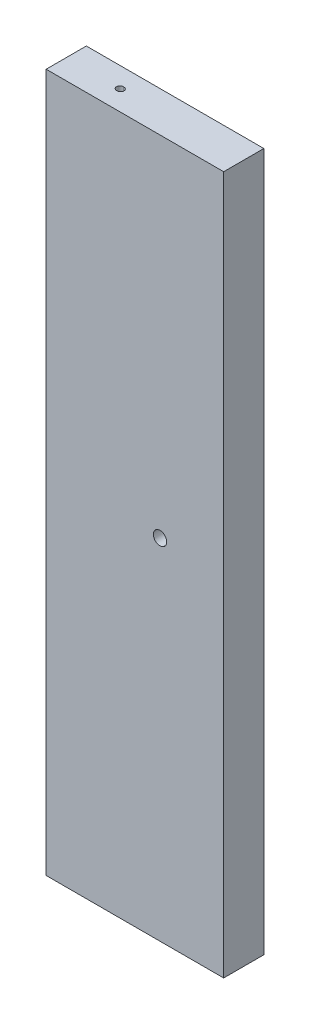
ISO-10303-21;
HEADER;
FILE_DESCRIPTION(('STEP AP214'),'2;1');
FILE_NAME('part.step','',(''),(''),'','','');
FILE_SCHEMA(('AUTOMOTIVE_DESIGN { 1 0 10303 214 1 1 1 1 }'));
ENDSEC;
DATA;
#1=APPLICATION_CONTEXT('core data for automotive mechanical design processes');
#2=APPLICATION_PROTOCOL_DEFINITION('international standard','automotive_design',2000,#1);
#3=PRODUCT_CONTEXT('',#1,'mechanical');
#4=PRODUCT('Part','Part','',(#3));
#5=PRODUCT_RELATED_PRODUCT_CATEGORY('part','',(#4));
#6=PRODUCT_DEFINITION_FORMATION('','',#4);
#7=PRODUCT_DEFINITION_CONTEXT('part definition',#1,'design');
#8=PRODUCT_DEFINITION('design','',#6,#7);
#9=PRODUCT_DEFINITION_SHAPE('','',#8);
#10=(LENGTH_UNIT() NAMED_UNIT(*) SI_UNIT(.MILLI.,.METRE.));
#11=(NAMED_UNIT(*) PLANE_ANGLE_UNIT() SI_UNIT($,.RADIAN.));
#12=(NAMED_UNIT(*) SI_UNIT($,.STERADIAN.) SOLID_ANGLE_UNIT());
#13=UNCERTAINTY_MEASURE_WITH_UNIT(LENGTH_MEASURE(1.E-05),#10,'distance_accuracy_value','');
#14=(GEOMETRIC_REPRESENTATION_CONTEXT(3) GLOBAL_UNCERTAINTY_ASSIGNED_CONTEXT((#13)) GLOBAL_UNIT_ASSIGNED_CONTEXT((#10,
#11,#12)) REPRESENTATION_CONTEXT('',''));
#15=CARTESIAN_POINT('',(0.,0.,0.));
#16=DIRECTION('',(0.,0.,1.));
#17=DIRECTION('',(1.,0.,0.));
#18=AXIS2_PLACEMENT_3D('',#15,#16,#17);
#19=CARTESIAN_POINT('',(209.352967180639,93.4499999969934,19.05));
#20=DIRECTION('',(1.,0.,0.));
#21=DIRECTION('',(0.,1.,0.));
#22=AXIS2_PLACEMENT_3D('',#19,#20,#21);
#23=PLANE('',#22);
#24=CARTESIAN_POINT('',(209.352967180642,-72.0249999970022,9.52499999998519));
#25=DIRECTION('',(1.,0.,0.));
#26=DIRECTION('',(0.,1.,0.));
#27=AXIS2_PLACEMENT_3D('',#24,#25,#26);
#28=CIRCLE('',#27,1.58750000000001);
#29=CARTESIAN_POINT('',(209.352967180642,-70.4374999970022,9.52499999998519));
#30=VERTEX_POINT('',#29);
#31=EDGE_CURVE('E144',#30,#30,#28,.T.);
#32=ORIENTED_EDGE('',*,*,#31,.T.);
#33=EDGE_LOOP('',(#32));
#34=FACE_BOUND('',#33,.T.);
#35=CARTESIAN_POINT('',(209.352967180644,-154.762499994006,9.52499999998514));
#36=DIRECTION('',(1.,0.,0.));
#37=DIRECTION('',(0.,1.,0.));
#38=AXIS2_PLACEMENT_3D('',#35,#36,#37);
#39=CIRCLE('',#38,1.58749999999999);
#40=CARTESIAN_POINT('',(209.352967180644,-153.174999994006,9.52499999998514));
#41=VERTEX_POINT('',#40);
#42=EDGE_CURVE('E148',#41,#41,#39,.T.);
#43=ORIENTED_EDGE('',*,*,#42,.T.);
#44=EDGE_LOOP('',(#43));
#45=FACE_BOUND('',#44,.T.);
#46=CARTESIAN_POINT('',(209.352967180641,10.7124999999862,9.52499999998519));
#47=DIRECTION('',(1.,0.,0.));
#48=DIRECTION('',(0.,1.,0.));
#49=AXIS2_PLACEMENT_3D('',#46,#47,#48);
#50=CIRCLE('',#49,1.5875);
#51=CARTESIAN_POINT('',(209.352967180641,12.2999999999862,9.52499999998519));
#52=VERTEX_POINT('',#51);
#53=EDGE_CURVE('E152',#52,#52,#50,.T.);
#54=ORIENTED_EDGE('',*,*,#53,.T.);
#55=EDGE_LOOP('',(#54));
#56=FACE_BOUND('',#55,.T.);
#57=DIRECTION('',(0.,-1.,0.));
#58=VECTOR('',#57,1.);
#59=CARTESIAN_POINT('',(209.352967180639,93.4499999969934,0.));
#60=LINE('',#59,#58);
#61=CARTESIAN_POINT('',(209.352967180639,93.4499999969934,0.));
#62=VERTEX_POINT('',#61);
#63=CARTESIAN_POINT('',(209.352967180645,-237.499999991006,0.));
#64=VERTEX_POINT('',#63);
#65=EDGE_CURVE('E156',#62,#64,#60,.T.);
#66=ORIENTED_EDGE('',*,*,#65,.T.);
#67=DIRECTION('',(0.,0.,-1.));
#68=VECTOR('',#67,1.);
#69=CARTESIAN_POINT('',(209.352967180645,-237.499999991006,19.05));
#70=LINE('',#69,#68);
#71=CARTESIAN_POINT('',(209.352967180645,-237.499999991006,19.05));
#72=VERTEX_POINT('',#71);
#73=EDGE_CURVE('E158',#72,#64,#70,.T.);
#74=ORIENTED_EDGE('',*,*,#73,.F.);
#75=DIRECTION('',(0.,-1.,0.));
#76=VECTOR('',#75,1.);
#77=CARTESIAN_POINT('',(209.352967180639,93.4499999969934,19.05));
#78=LINE('',#77,#76);
#79=CARTESIAN_POINT('',(209.352967180639,93.4499999969934,19.05));
#80=VERTEX_POINT('',#79);
#81=EDGE_CURVE('E177',#80,#72,#78,.T.);
#82=ORIENTED_EDGE('',*,*,#81,.F.);
#83=DIRECTION('',(0.,0.,-1.));
#84=VECTOR('',#83,1.);
#85=CARTESIAN_POINT('',(209.352967180639,93.4499999969934,19.05));
#86=LINE('',#85,#84);
#87=EDGE_CURVE('E159',#80,#62,#86,.T.);
#88=ORIENTED_EDGE('',*,*,#87,.T.);
#89=EDGE_LOOP('',(#66,#74,#82,#88));
#90=FACE_BOUND('',#89,.T.);
#91=ADVANCED_FACE('F41',(#34,#45,#56,#90),#23,.F.);
#92=CARTESIAN_POINT('',(209.352967180645,-237.499999991006,19.05));
#93=DIRECTION('',(0.,1.,0.));
#94=DIRECTION('',(0.,0.,1.));
#95=AXIS2_PLACEMENT_3D('',#92,#93,#94);
#96=PLANE('',#95);
#97=DIRECTION('',(1.,0.,0.));
#98=VECTOR('',#97,1.);
#99=CARTESIAN_POINT('',(209.352967180645,-237.499999991006,0.));
#100=LINE('',#99,#98);
#101=CARTESIAN_POINT('',(293.490829294251,-237.499999991006,0.));
#102=VERTEX_POINT('',#101);
#103=EDGE_CURVE('E162',#64,#102,#100,.T.);
#104=ORIENTED_EDGE('',*,*,#103,.T.);
#105=DIRECTION('',(0.,0.,-1.));
#106=VECTOR('',#105,1.);
#107=CARTESIAN_POINT('',(293.490829294251,-237.499999991006,19.05));
#108=LINE('',#107,#106);
#109=CARTESIAN_POINT('',(293.490829294251,-237.499999991006,19.05));
#110=VERTEX_POINT('',#109);
#111=EDGE_CURVE('E181',#110,#102,#108,.T.);
#112=ORIENTED_EDGE('',*,*,#111,.F.);
#113=DIRECTION('',(1.,0.,0.));
#114=VECTOR('',#113,1.);
#115=CARTESIAN_POINT('',(209.352967180645,-237.499999991006,19.05));
#116=LINE('',#115,#114);
#117=EDGE_CURVE('E95',#72,#110,#116,.T.);
#118=ORIENTED_EDGE('',*,*,#117,.F.);
#119=ORIENTED_EDGE('',*,*,#73,.T.);
#120=EDGE_LOOP('',(#104,#112,#118,#119));
#121=FACE_BOUND('',#120,.T.);
#122=ADVANCED_FACE('F135',(#121),#96,.F.);
#123=CARTESIAN_POINT('',(293.490829294251,93.4499999969934,19.05));
#124=DIRECTION('',(-1.,0.,0.));
#125=DIRECTION('',(0.,-1.,0.));
#126=AXIS2_PLACEMENT_3D('',#123,#124,#125);
#127=PLANE('',#126);
#128=DIRECTION('',(0.,1.,0.));
#129=VECTOR('',#128,1.);
#130=CARTESIAN_POINT('',(293.490829294251,93.4499999969934,0.));
#131=LINE('',#130,#129);
#132=CARTESIAN_POINT('',(293.490829294251,93.4499999969934,0.));
#133=VERTEX_POINT('',#132);
#134=EDGE_CURVE('E167',#102,#133,#131,.T.);
#135=ORIENTED_EDGE('',*,*,#134,.T.);
#136=DIRECTION('',(0.,0.,-1.));
#137=VECTOR('',#136,1.);
#138=CARTESIAN_POINT('',(293.490829294251,93.4499999969934,19.05));
#139=LINE('',#138,#137);
#140=CARTESIAN_POINT('',(293.490829294251,93.4499999969934,19.05));
#141=VERTEX_POINT('',#140);
#142=EDGE_CURVE('E179',#141,#133,#139,.T.);
#143=ORIENTED_EDGE('',*,*,#142,.F.);
#144=DIRECTION('',(0.,1.,0.));
#145=VECTOR('',#144,1.);
#146=CARTESIAN_POINT('',(293.490829294251,93.4499999969934,19.05));
#147=LINE('',#146,#145);
#148=EDGE_CURVE('E225',#110,#141,#147,.T.);
#149=ORIENTED_EDGE('',*,*,#148,.F.);
#150=ORIENTED_EDGE('',*,*,#111,.T.);
#151=EDGE_LOOP('',(#135,#143,#149,#150));
#152=FACE_BOUND('',#151,.T.);
#153=ADVANCED_FACE('F140',(#152),#127,.F.);
#154=CARTESIAN_POINT('',(209.352967180639,93.4499999969934,19.05));
#155=DIRECTION('',(0.,-1.,0.));
#156=DIRECTION('',(0.,0.,-1.));
#157=AXIS2_PLACEMENT_3D('',#154,#155,#156);
#158=PLANE('',#157);
#159=CARTESIAN_POINT('',(234.752967180665,93.4499999969934,9.52499999998517));
#160=DIRECTION('',(0.,-1.,0.));
#161=DIRECTION('',(0.,0.,-1.));
#162=AXIS2_PLACEMENT_3D('',#159,#160,#161);
#163=CIRCLE('',#162,1.58749999999999);
#164=CARTESIAN_POINT('',(234.93568221754,93.4499999969934,11.1019500516036));
#165=VERTEX_POINT('',#164);
#166=CARTESIAN_POINT('',(234.935682217272,93.4499999969934,7.94804994833567));
#167=VERTEX_POINT('',#166);
#168=EDGE_CURVE('E192',#165,#167,#163,.T.);
#169=ORIENTED_EDGE('',*,*,#168,.T.);
#170=CARTESIAN_POINT('',(235.118397254148,93.4499999969934,9.52499999995414));
#171=DIRECTION('',(0.,-1.,0.));
#172=DIRECTION('',(0.,0.,-1.));
#173=AXIS2_PLACEMENT_3D('',#170,#171,#172);
#174=CIRCLE('',#173,1.58749999999999);
#175=EDGE_CURVE('E282',#167,#165,#174,.T.);
#176=ORIENTED_EDGE('',*,*,#175,.T.);
#177=EDGE_LOOP('',(#169,#176));
#178=FACE_BOUND('',#177,.T.);
#179=DIRECTION('',(-1.,0.,0.));
#180=VECTOR('',#179,1.);
#181=CARTESIAN_POINT('',(209.352967180639,93.4499999969934,0.));
#182=LINE('',#181,#180);
#183=EDGE_CURVE('E86',#133,#62,#182,.T.);
#184=ORIENTED_EDGE('',*,*,#183,.T.);
#185=ORIENTED_EDGE('',*,*,#87,.F.);
#186=DIRECTION('',(-1.,0.,0.));
#187=VECTOR('',#186,1.);
#188=CARTESIAN_POINT('',(209.352967180639,93.4499999969934,19.05));
#189=LINE('',#188,#187);
#190=EDGE_CURVE('E63',#141,#80,#189,.T.);
#191=ORIENTED_EDGE('',*,*,#190,.F.);
#192=ORIENTED_EDGE('',*,*,#142,.T.);
#193=EDGE_LOOP('',(#184,#185,#191,#192));
#194=FACE_BOUND('',#193,.T.);
#195=ADVANCED_FACE('F231',(#178,#194),#158,.F.);
#196=CARTESIAN_POINT('',(0.,0.,19.05));
#197=DIRECTION('',(0.,0.,1.));
#198=DIRECTION('',(1.,0.,0.));
#199=AXIS2_PLACEMENT_3D('',#196,#197,#198);
#200=PLANE('',#199);
#201=CARTESIAN_POINT('',(263.328329294251,-72.0249999970064,19.05));
#202=DIRECTION('',(0.,0.,-1.));
#203=DIRECTION('',(-1.,0.,0.));
#204=AXIS2_PLACEMENT_3D('',#201,#202,#203);
#205=CIRCLE('',#204,3.17499999999993);
#206=CARTESIAN_POINT('',(260.153329294252,-72.0249999970064,19.05));
#207=VERTEX_POINT('',#206);
#208=EDGE_CURVE('E206',#207,#207,#205,.T.);
#209=ORIENTED_EDGE('',*,*,#208,.T.);
#210=EDGE_LOOP('',(#209));
#211=FACE_BOUND('',#210,.T.);
#212=ORIENTED_EDGE('',*,*,#81,.T.);
#213=ORIENTED_EDGE('',*,*,#117,.T.);
#214=ORIENTED_EDGE('',*,*,#148,.T.);
#215=ORIENTED_EDGE('',*,*,#190,.T.);
#216=EDGE_LOOP('',(#212,#213,#214,#215));
#217=FACE_BOUND('',#216,.T.);
#218=ADVANCED_FACE('F228',(#211,#217),#200,.T.);
#219=CARTESIAN_POINT('',(0.,0.,0.));
#220=DIRECTION('',(0.,0.,1.));
#221=DIRECTION('',(1.,0.,0.));
#222=AXIS2_PLACEMENT_3D('',#219,#220,#221);
#223=PLANE('',#222);
#224=CARTESIAN_POINT('',(263.328329294251,-72.0249999970064,0.));
#225=DIRECTION('',(0.,0.,-1.));
#226=DIRECTION('',(-1.,0.,0.));
#227=AXIS2_PLACEMENT_3D('',#224,#225,#226);
#228=CIRCLE('',#227,3.17499999999993);
#229=CARTESIAN_POINT('',(260.153329294252,-72.0249999970064,0.));
#230=VERTEX_POINT('',#229);
#231=EDGE_CURVE('E210',#230,#230,#228,.T.);
#232=ORIENTED_EDGE('',*,*,#231,.F.);
#233=EDGE_LOOP('',(#232));
#234=FACE_BOUND('',#233,.T.);
#235=ORIENTED_EDGE('',*,*,#65,.F.);
#236=ORIENTED_EDGE('',*,*,#183,.F.);
#237=ORIENTED_EDGE('',*,*,#134,.F.);
#238=ORIENTED_EDGE('',*,*,#103,.F.);
#239=EDGE_LOOP('',(#235,#236,#237,#238));
#240=FACE_BOUND('',#239,.T.);
#241=ADVANCED_FACE('F239',(#234,#240),#223,.F.);
#242=CARTESIAN_POINT('',(196.652967180676,10.7124999999862,9.52499999998541));
#243=DIRECTION('',(-1.,0.,0.));
#244=DIRECTION('',(0.,0.,1.));
#245=AXIS2_PLACEMENT_3D('',#242,#243,#244);
#246=CYLINDRICAL_SURFACE('',#245,1.5875);
#247=CARTESIAN_POINT('',(228.402967180676,10.7124999999862,9.52499999998487));
#248=DIRECTION('',(-1.,0.,0.));
#249=DIRECTION('',(0.,0.,1.));
#250=AXIS2_PLACEMENT_3D('',#247,#248,#249);
#251=CIRCLE('',#250,1.5875);
#252=CARTESIAN_POINT('',(228.402967180676,10.7124999999862,11.1124999999849));
#253=VERTEX_POINT('',#252);
#254=EDGE_CURVE('E169',#253,#253,#251,.T.);
#255=ORIENTED_EDGE('',*,*,#254,.F.);
#256=EDGE_LOOP('',(#255));
#257=FACE_BOUND('',#256,.T.);
#258=ORIENTED_EDGE('',*,*,#53,.F.);
#259=EDGE_LOOP('',(#258));
#260=FACE_BOUND('',#259,.T.);
#261=ADVANCED_FACE('F245',(#257,#260),#246,.F.);
#262=CARTESIAN_POINT('',(228.402967180676,10.7124999999862,9.52499999998487));
#263=DIRECTION('',(-1.,0.,0.));
#264=DIRECTION('',(0.,0.,1.));
#265=AXIS2_PLACEMENT_3D('',#262,#263,#264);
#266=CONICAL_SURFACE('',#265,1.5875,1.02974425867666);
#267=CARTESIAN_POINT('',(229.356833413382,10.7124999999862,9.52499999998486));
#268=VERTEX_POINT('',#267);
#269=VERTEX_LOOP('',#268);
#270=FACE_BOUND('',#269,.T.);
#271=ORIENTED_EDGE('',*,*,#254,.T.);
#272=EDGE_LOOP('',(#271));
#273=FACE_BOUND('',#272,.T.);
#274=ADVANCED_FACE('F248',(#270,#273),#266,.F.);
#275=CARTESIAN_POINT('',(196.652967180677,-154.762499994006,9.52499999998535));
#276=DIRECTION('',(-1.,0.,0.));
#277=DIRECTION('',(0.,0.,1.));
#278=AXIS2_PLACEMENT_3D('',#275,#276,#277);
#279=CYLINDRICAL_SURFACE('',#278,1.58749999999999);
#280=CARTESIAN_POINT('',(228.402967180677,-154.762499994006,9.52499999998482));
#281=DIRECTION('',(-1.,0.,0.));
#282=DIRECTION('',(0.,0.,1.));
#283=AXIS2_PLACEMENT_3D('',#280,#281,#282);
#284=CIRCLE('',#283,1.58749999999999);
#285=CARTESIAN_POINT('',(228.402967180677,-154.762499994006,11.1124999999848));
#286=VERTEX_POINT('',#285);
#287=EDGE_CURVE('E188',#286,#286,#284,.T.);
#288=ORIENTED_EDGE('',*,*,#287,.F.);
#289=EDGE_LOOP('',(#288));
#290=FACE_BOUND('',#289,.T.);
#291=ORIENTED_EDGE('',*,*,#42,.F.);
#292=EDGE_LOOP('',(#291));
#293=FACE_BOUND('',#292,.T.);
#294=ADVANCED_FACE('F251',(#290,#293),#279,.F.);
#295=CARTESIAN_POINT('',(228.402967180677,-154.762499994006,9.52499999998482));
#296=DIRECTION('',(-1.,0.,0.));
#297=DIRECTION('',(0.,0.,1.));
#298=AXIS2_PLACEMENT_3D('',#295,#296,#297);
#299=CONICAL_SURFACE('',#298,1.58749999999999,1.02974425867666);
#300=CARTESIAN_POINT('',(229.356833413383,-154.762499994006,9.5249999999848));
#301=VERTEX_POINT('',#300);
#302=VERTEX_LOOP('',#301);
#303=FACE_BOUND('',#302,.T.);
#304=ORIENTED_EDGE('',*,*,#287,.T.);
#305=EDGE_LOOP('',(#304));
#306=FACE_BOUND('',#305,.T.);
#307=ADVANCED_FACE('F256',(#303,#306),#299,.F.);
#308=CARTESIAN_POINT('',(196.652967180676,-72.0249999970022,9.52499999998541));
#309=DIRECTION('',(-1.,0.,0.));
#310=DIRECTION('',(0.,0.,1.));
#311=AXIS2_PLACEMENT_3D('',#308,#309,#310);
#312=CYLINDRICAL_SURFACE('',#311,1.58750000000001);
#313=CARTESIAN_POINT('',(228.402967180676,-72.0249999970022,9.52499999998487));
#314=DIRECTION('',(-1.,0.,0.));
#315=DIRECTION('',(0.,0.,1.));
#316=AXIS2_PLACEMENT_3D('',#313,#314,#315);
#317=CIRCLE('',#316,1.58750000000001);
#318=CARTESIAN_POINT('',(228.402967180676,-72.0249999970022,11.1124999999849));
#319=VERTEX_POINT('',#318);
#320=EDGE_CURVE('E191',#319,#319,#317,.T.);
#321=ORIENTED_EDGE('',*,*,#320,.F.);
#322=EDGE_LOOP('',(#321));
#323=FACE_BOUND('',#322,.T.);
#324=ORIENTED_EDGE('',*,*,#31,.F.);
#325=EDGE_LOOP('',(#324));
#326=FACE_BOUND('',#325,.T.);
#327=ADVANCED_FACE('F259',(#323,#326),#312,.F.);
#328=CARTESIAN_POINT('',(228.402967180676,-72.0249999970022,9.52499999998487));
#329=DIRECTION('',(-1.,0.,0.));
#330=DIRECTION('',(0.,0.,1.));
#331=AXIS2_PLACEMENT_3D('',#328,#329,#330);
#332=CONICAL_SURFACE('',#331,1.58750000000001,1.02974425867666);
#333=CARTESIAN_POINT('',(229.356833413383,-72.0249999970022,9.52499999998486));
#334=VERTEX_POINT('',#333);
#335=VERTEX_LOOP('',#334);
#336=FACE_BOUND('',#335,.T.);
#337=ORIENTED_EDGE('',*,*,#320,.T.);
#338=EDGE_LOOP('',(#337));
#339=FACE_BOUND('',#338,.T.);
#340=ADVANCED_FACE('F264',(#336,#339),#332,.F.);
#341=CARTESIAN_POINT('',(234.752967180665,112.499999996992,9.52499999998513));
#342=DIRECTION('',(0.,1.,0.));
#343=DIRECTION('',(0.,0.,1.));
#344=AXIS2_PLACEMENT_3D('',#341,#342,#343);
#345=CYLINDRICAL_SURFACE('',#344,1.58749999999999);
#346=CARTESIAN_POINT('',(234.752967180665,74.3999999969923,9.52499999998522));
#347=DIRECTION('',(0.,1.,0.));
#348=DIRECTION('',(0.,0.,1.));
#349=AXIS2_PLACEMENT_3D('',#346,#347,#348);
#350=CIRCLE('',#349,1.58749999999999);
#351=CARTESIAN_POINT('',(234.935682217126,74.3999999969923,7.94804994831872));
#352=VERTEX_POINT('',#351);
#353=CARTESIAN_POINT('',(234.935682217541,74.399999996972,11.1019500516037));
#354=VERTEX_POINT('',#353);
#355=EDGE_CURVE('E194',#352,#354,#350,.T.);
#356=ORIENTED_EDGE('',*,*,#355,.F.);
#357=DIRECTION('',(0.,1.,0.));
#358=VECTOR('',#357,1.);
#359=CARTESIAN_POINT('',(234.935682217272,91.4411691658623,7.94804994833567));
#360=LINE('',#359,#358);
#361=EDGE_CURVE('E11',#352,#167,#360,.T.);
#362=ORIENTED_EDGE('',*,*,#361,.T.);
#363=ORIENTED_EDGE('',*,*,#168,.F.);
#364=DIRECTION('',(0.,1.,0.));
#365=VECTOR('',#364,1.);
#366=CARTESIAN_POINT('',(234.93568221754,91.4411691658623,11.1019500516036));
#367=LINE('',#366,#365);
#368=EDGE_CURVE('E48',#165,#354,#367,.F.);
#369=ORIENTED_EDGE('',*,*,#368,.T.);
#370=EDGE_LOOP('',(#356,#362,#363,#369));
#371=FACE_BOUND('',#370,.T.);
#372=ADVANCED_FACE('F200',(#371),#345,.F.);
#373=CARTESIAN_POINT('',(234.752967180665,74.3999999969923,9.52499999998522));
#374=DIRECTION('',(0.,1.,0.));
#375=DIRECTION('',(0.,0.,1.));
#376=AXIS2_PLACEMENT_3D('',#373,#374,#375);
#377=CONICAL_SURFACE('',#376,1.58749999999999,1.02974425867666);
#378=CARTESIAN_POINT('',(234.752967180665,73.446133764286,9.52499999998522));
#379=VERTEX_POINT('',#378);
#380=VERTEX_LOOP('',#379);
#381=FACE_BOUND('',#380,.T.);
#382=ORIENTED_EDGE('',*,*,#355,.T.);
#383=CARTESIAN_POINT('',(234.935682217394,74.400199996972,11.1022851338498));
#384=CARTESIAN_POINT('',(234.935682217394,74.3620484747118,11.0383600925731));
#385=CARTESIAN_POINT('',(234.935682217395,74.3239148835329,10.9744243215717));
#386=CARTESIAN_POINT('',(234.935682217396,74.2477148281181,10.8465111747796));
#387=CARTESIAN_POINT('',(234.935682217396,74.2096483651533,10.7825337982317));
#388=CARTESIAN_POINT('',(234.935682217397,74.133491197974,10.6543108053804));
#389=CARTESIAN_POINT('',(234.935682217397,74.0954008200617,10.5900649950563));
#390=CARTESIAN_POINT('',(234.935682217398,74.0193919405316,10.4614729887092));
#391=CARTESIAN_POINT('',(234.935682217398,73.981473436539,10.3971267940899));
#392=CARTESIAN_POINT('',(234.935682217399,73.904368098856,10.2655743548656));
#393=CARTESIAN_POINT('',(234.935682217399,73.8651941509017,10.1983605241522));
#394=CARTESIAN_POINT('',(234.9356822174,73.8070444473877,10.0972715653764));
#395=CARTESIAN_POINT('',(234.9356822174,73.7877810362338,10.0635625916655));
#396=CARTESIAN_POINT('',(234.9356822174,73.7495867879675,9.99596016498248));
#397=CARTESIAN_POINT('',(234.9356822174,73.7306559281702,9.96206672480199));
#398=CARTESIAN_POINT('',(234.9356822174,73.6921543359355,9.89173767381329));
#399=CARTESIAN_POINT('',(234.9356822174,73.6726223655251,9.85528040188808));
#400=CARTESIAN_POINT('',(234.935682217399,73.6443965887261,9.79992681475077));
#401=CARTESIAN_POINT('',(234.935682217399,73.6351449761681,9.78131709912516));
#402=CARTESIAN_POINT('',(234.935682217399,73.6172748206918,9.74379769298302));
#403=CARTESIAN_POINT('',(234.935682217398,73.6086561047496,9.72488808618388));
#404=CARTESIAN_POINT('',(234.935682217398,73.5912681898844,9.68377343267567));
#405=CARTESIAN_POINT('',(234.935682217397,73.5826667188124,9.66149602455247));
#406=CARTESIAN_POINT('',(234.935682217395,73.5683067825435,9.61619274917335));
#407=CARTESIAN_POINT('',(234.935682217394,73.5625189351938,9.59317741645474));
#408=CARTESIAN_POINT('',(234.935682217392,73.5577974949864,9.56019985734955));
#409=CARTESIAN_POINT('',(234.935682217392,73.5568346672959,9.55053573159251));
#410=CARTESIAN_POINT('',(234.93568221739,73.5558298920355,9.53116216921845));
#411=CARTESIAN_POINT('',(234.935682217389,73.5557875482943,9.52145275389362));
#412=CARTESIAN_POINT('',(234.935682217387,73.5566303230167,9.50201906406679));
#413=CARTESIAN_POINT('',(234.935682217386,73.5575208430733,9.49229503221199));
#414=CARTESIAN_POINT('',(234.935682217384,73.5601457654959,9.47296314965848));
#415=CARTESIAN_POINT('',(234.935682217383,73.5618802958118,9.46335531680165));
#416=CARTESIAN_POINT('',(234.935682217379,73.5701794046404,9.42524315744087));
#417=CARTESIAN_POINT('',(234.935682217375,73.5794680185203,9.39735807733265));
#418=CARTESIAN_POINT('',(234.935682217367,73.6007440583212,9.34262118654139));
#419=CARTESIAN_POINT('',(234.935682217363,73.6127455258351,9.31577563486809));
#420=CARTESIAN_POINT('',(234.935682217354,73.6383001516156,9.26199814671073));
#421=CARTESIAN_POINT('',(234.93568221735,73.6518847361324,9.2350810079685));
#422=CARTESIAN_POINT('',(234.935682217341,73.6796825150933,9.1816783552299));
#423=CARTESIAN_POINT('',(234.935682217337,73.6938938564427,9.1551918491141));
#424=CARTESIAN_POINT('',(234.935682217323,73.7372398323309,9.07572918278401));
#425=CARTESIAN_POINT('',(234.935682217314,73.7669300751915,9.02305640976419));
#426=CARTESIAN_POINT('',(234.935682217296,73.8268826795137,8.91803677721487));
#427=CARTESIAN_POINT('',(234.935682217287,73.8571450959757,8.86568994966648));
#428=CARTESIAN_POINT('',(234.935682217269,73.9180137957708,8.76109800754902));
#429=CARTESIAN_POINT('',(234.93568221726,73.9486205003034,8.7088531371166));
#430=CARTESIAN_POINT('',(234.935682217241,74.0100014665927,8.60446529163354));
#431=CARTESIAN_POINT('',(234.935682217232,74.0407757212812,8.55232231240866));
#432=CARTESIAN_POINT('',(234.935682217207,74.1261861576998,8.40792677508193));
#433=CARTESIAN_POINT('',(234.935682217191,74.18093070497,8.31573831452499));
#434=CARTESIAN_POINT('',(234.935682217158,74.2905120721569,8.13160185353176));
#435=CARTESIAN_POINT('',(234.935682217142,74.3453486336524,8.03965369939701));
#436=CARTESIAN_POINT('',(234.935682217126,74.400199996972,7.94771486608953));
#437=B_SPLINE_CURVE_WITH_KNOTS('',3,(#383,#384,#385,#386,#387,#388,#389,#390,#391,#392,#393,
#394,#395,#396,#397,#398,#399,#400,#401,#402,#403,#404,#405,#406,#407,#408,#409,#410,#411,#412,
#413,#414,#415,#416,#417,#418,#419,#420,#421,#422,#423,#424,#425,#426,#427,#428,#429,#430,#431,
#432,#433,#434,#435,#436),.UNSPECIFIED.,.F.,.F.,(4,2,2,2,2,2,2,2,2,2,2,2,2,2,2,2,2,2,2,2,2,2,2,
2,2,2,4),(0.,0.22333284221715,0.446669869426369,0.670735746354478,0.89479851794023,
1.1281856260805,1.24465879421116,1.36112398600185,1.48518308281711,1.54752428454857,
1.60984837923911,1.68142792520996,1.752243002849,1.78133854223877,1.81042155881825,
1.83967391153748,1.86893070022228,1.95667245035541,2.04487919147892,2.13530362748129,
2.22547661009159,2.40685448436051,2.5882498831622,2.76989860578427,2.95153972374672,
3.27319304027862,3.59436785377752),.UNSPECIFIED.);
#438=EDGE_CURVE('E205',#354,#352,#437,.T.);
#439=ORIENTED_EDGE('',*,*,#438,.T.);
#440=EDGE_LOOP('',(#382,#439));
#441=FACE_BOUND('',#440,.T.);
#442=ADVANCED_FACE('F204',(#381,#441),#377,.F.);
#443=CARTESIAN_POINT('',(263.328329294251,-72.0249999970064,0.));
#444=DIRECTION('',(0.,0.,-1.));
#445=DIRECTION('',(-1.,0.,0.));
#446=AXIS2_PLACEMENT_3D('',#443,#444,#445);
#447=CYLINDRICAL_SURFACE('',#446,3.17499999999993);
#448=ORIENTED_EDGE('',*,*,#208,.F.);
#449=EDGE_LOOP('',(#448));
#450=FACE_BOUND('',#449,.T.);
#451=ORIENTED_EDGE('',*,*,#231,.T.);
#452=EDGE_LOOP('',(#451));
#453=FACE_BOUND('',#452,.T.);
#454=ADVANCED_FACE('F129',(#450,#453),#447,.F.);
#455=CARTESIAN_POINT('',(235.118397254148,112.499999996972,9.52499999995415));
#456=DIRECTION('',(0.,1.,0.));
#457=DIRECTION('',(0.,0.,1.));
#458=AXIS2_PLACEMENT_3D('',#455,#456,#457);
#459=CYLINDRICAL_SURFACE('',#458,1.58749999999999);
#460=CARTESIAN_POINT('',(235.118397254148,74.399999996972,9.52499999995412));
#461=DIRECTION('',(0.,1.,0.));
#462=DIRECTION('',(0.,0.,1.));
#463=AXIS2_PLACEMENT_3D('',#460,#461,#462);
#464=CIRCLE('',#463,1.58749999999999);
#465=EDGE_CURVE('E54',#354,#352,#464,.T.);
#466=ORIENTED_EDGE('',*,*,#465,.F.);
#467=ORIENTED_EDGE('',*,*,#368,.F.);
#468=ORIENTED_EDGE('',*,*,#175,.F.);
#469=ORIENTED_EDGE('',*,*,#361,.F.);
#470=EDGE_LOOP('',(#466,#467,#468,#469));
#471=FACE_BOUND('',#470,.T.);
#472=ADVANCED_FACE('F124',(#471),#459,.F.);
#473=CARTESIAN_POINT('',(235.118397254148,74.399999996972,9.52499999995412));
#474=DIRECTION('',(0.,1.,0.));
#475=DIRECTION('',(0.,0.,1.));
#476=AXIS2_PLACEMENT_3D('',#473,#474,#475);
#477=CONICAL_SURFACE('',#476,1.58749999999999,1.02974425867666);
#478=CARTESIAN_POINT('',(235.118397254148,73.4461337642658,9.52499999995412));
#479=VERTEX_POINT('',#478);
#480=VERTEX_LOOP('',#479);
#481=FACE_BOUND('',#480,.T.);
#482=ORIENTED_EDGE('',*,*,#465,.T.);
#483=ORIENTED_EDGE('',*,*,#438,.F.);
#484=EDGE_LOOP('',(#482,#483));
#485=FACE_BOUND('',#484,.T.);
#486=ADVANCED_FACE('F122',(#481,#485),#477,.F.);
#487=CLOSED_SHELL('',(#91,#122,#153,#195,#218,#241,#261,#274,#294,#307,#327,#340,#372,#442,#454,
#472,#486));
#488=MANIFOLD_SOLID_BREP('B2',#487);
#489=ADVANCED_BREP_SHAPE_REPRESENTATION('',(#18,#488),#14);
#490=SHAPE_DEFINITION_REPRESENTATION(#9,#489);
ENDSEC;
END-ISO-10303-21;
